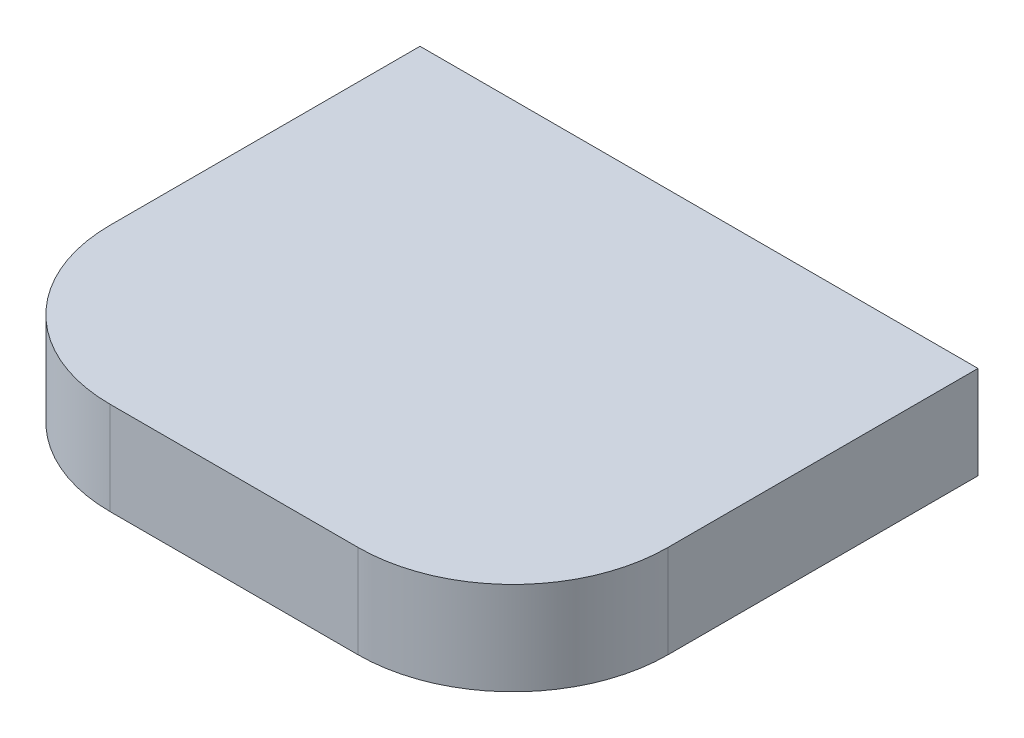
ISO-10303-21;
HEADER;
FILE_DESCRIPTION(('STEP AP214'),'2;1');
FILE_NAME('part.step','',(''),(''),'','','');
FILE_SCHEMA(('AUTOMOTIVE_DESIGN { 1 0 10303 214 1 1 1 1 }'));
ENDSEC;
DATA;
#1=APPLICATION_CONTEXT('core data for automotive mechanical design processes');
#2=APPLICATION_PROTOCOL_DEFINITION('international standard','automotive_design',2000,#1);
#3=PRODUCT_CONTEXT('',#1,'mechanical');
#4=PRODUCT('Part','Part','',(#3));
#5=PRODUCT_RELATED_PRODUCT_CATEGORY('part','',(#4));
#6=PRODUCT_DEFINITION_FORMATION('','',#4);
#7=PRODUCT_DEFINITION_CONTEXT('part definition',#1,'design');
#8=PRODUCT_DEFINITION('design','',#6,#7);
#9=PRODUCT_DEFINITION_SHAPE('','',#8);
#10=(LENGTH_UNIT() NAMED_UNIT(*) SI_UNIT(.MILLI.,.METRE.));
#11=(NAMED_UNIT(*) PLANE_ANGLE_UNIT() SI_UNIT($,.RADIAN.));
#12=(NAMED_UNIT(*) SI_UNIT($,.STERADIAN.) SOLID_ANGLE_UNIT());
#13=UNCERTAINTY_MEASURE_WITH_UNIT(LENGTH_MEASURE(1.E-05),#10,'distance_accuracy_value','');
#14=(GEOMETRIC_REPRESENTATION_CONTEXT(3) GLOBAL_UNCERTAINTY_ASSIGNED_CONTEXT((#13)) GLOBAL_UNIT_ASSIGNED_CONTEXT((#10,
#11,#12)) REPRESENTATION_CONTEXT('',''));
#15=CARTESIAN_POINT('',(0.,0.,0.));
#16=DIRECTION('',(0.,0.,1.));
#17=DIRECTION('',(1.,0.,0.));
#18=AXIS2_PLACEMENT_3D('',#15,#16,#17);
#19=CARTESIAN_POINT('',(-22.86,7.62,-19.19));
#20=DIRECTION('',(1.,0.,0.));
#21=DIRECTION('',(0.,0.,-1.));
#22=AXIS2_PLACEMENT_3D('',#19,#20,#21);
#23=PLANE('',#22);
#24=DIRECTION('',(0.,0.,1.));
#25=VECTOR('',#24,1.);
#26=CARTESIAN_POINT('',(-22.86,0.,-19.19));
#27=LINE('',#26,#25);
#28=CARTESIAN_POINT('',(-22.86,0.,-19.19));
#29=VERTEX_POINT('',#28);
#30=CARTESIAN_POINT('',(-22.86,0.,6.21));
#31=VERTEX_POINT('',#30);
#32=EDGE_CURVE('E121',#29,#31,#27,.T.);
#33=ORIENTED_EDGE('',*,*,#32,.T.);
#34=DIRECTION('',(0.,-1.,0.));
#35=VECTOR('',#34,1.);
#36=CARTESIAN_POINT('',(-22.86,7.62,6.21));
#37=LINE('',#36,#35);
#38=CARTESIAN_POINT('',(-22.86,7.62,6.21));
#39=VERTEX_POINT('',#38);
#40=EDGE_CURVE('E11',#39,#31,#37,.T.);
#41=ORIENTED_EDGE('',*,*,#40,.F.);
#42=DIRECTION('',(0.,0.,1.));
#43=VECTOR('',#42,1.);
#44=CARTESIAN_POINT('',(-22.86,7.62,-19.19));
#45=LINE('',#44,#43);
#46=CARTESIAN_POINT('',(-22.86,7.62,-19.19));
#47=VERTEX_POINT('',#46);
#48=EDGE_CURVE('E131',#47,#39,#45,.T.);
#49=ORIENTED_EDGE('',*,*,#48,.F.);
#50=DIRECTION('',(0.,-1.,0.));
#51=VECTOR('',#50,1.);
#52=CARTESIAN_POINT('',(-22.86,7.62,-19.19));
#53=LINE('',#52,#51);
#54=EDGE_CURVE('E117',#47,#29,#53,.T.);
#55=ORIENTED_EDGE('',*,*,#54,.T.);
#56=EDGE_LOOP('',(#33,#41,#49,#55));
#57=FACE_BOUND('',#56,.T.);
#58=ADVANCED_FACE('F37',(#57),#23,.F.);
#59=CARTESIAN_POINT('',(-10.16,7.62,6.21));
#60=DIRECTION('',(0.,-1.,0.));
#61=DIRECTION('',(0.,0.,-1.));
#62=AXIS2_PLACEMENT_3D('',#59,#60,#61);
#63=CYLINDRICAL_SURFACE('',#62,12.7);
#64=CARTESIAN_POINT('',(-10.16,0.,6.21));
#65=DIRECTION('',(0.,1.,0.));
#66=DIRECTION('',(0.,0.,1.));
#67=AXIS2_PLACEMENT_3D('',#64,#65,#66);
#68=CIRCLE('',#67,12.7);
#69=CARTESIAN_POINT('',(-10.16,0.,18.91));
#70=VERTEX_POINT('',#69);
#71=EDGE_CURVE('E124',#31,#70,#68,.T.);
#72=ORIENTED_EDGE('',*,*,#71,.T.);
#73=DIRECTION('',(0.,-1.,0.));
#74=VECTOR('',#73,1.);
#75=CARTESIAN_POINT('',(-10.16,7.62,18.91));
#76=LINE('',#75,#74);
#77=CARTESIAN_POINT('',(-10.16,7.62,18.91));
#78=VERTEX_POINT('',#77);
#79=EDGE_CURVE('E45',#78,#70,#76,.T.);
#80=ORIENTED_EDGE('',*,*,#79,.F.);
#81=CARTESIAN_POINT('',(-10.16,7.62,6.21));
#82=DIRECTION('',(0.,1.,0.));
#83=DIRECTION('',(0.,0.,1.));
#84=AXIS2_PLACEMENT_3D('',#81,#82,#83);
#85=CIRCLE('',#84,12.7);
#86=EDGE_CURVE('E90',#39,#78,#85,.T.);
#87=ORIENTED_EDGE('',*,*,#86,.F.);
#88=ORIENTED_EDGE('',*,*,#40,.T.);
#89=EDGE_LOOP('',(#72,#80,#87,#88));
#90=FACE_BOUND('',#89,.T.);
#91=ADVANCED_FACE('F155',(#90),#63,.T.);
#92=CARTESIAN_POINT('',(-10.16,7.62,18.91));
#93=DIRECTION('',(0.,0.,-1.));
#94=DIRECTION('',(-1.,0.,0.));
#95=AXIS2_PLACEMENT_3D('',#92,#93,#94);
#96=PLANE('',#95);
#97=DIRECTION('',(1.,0.,0.));
#98=VECTOR('',#97,1.);
#99=CARTESIAN_POINT('',(-10.16,0.,18.91));
#100=LINE('',#99,#98);
#101=CARTESIAN_POINT('',(10.16,0.,18.91));
#102=VERTEX_POINT('',#101);
#103=EDGE_CURVE('E126',#70,#102,#100,.T.);
#104=ORIENTED_EDGE('',*,*,#103,.T.);
#105=DIRECTION('',(0.,-1.,0.));
#106=VECTOR('',#105,1.);
#107=CARTESIAN_POINT('',(10.16,7.62,18.91));
#108=LINE('',#107,#106);
#109=CARTESIAN_POINT('',(10.16,7.62,18.91));
#110=VERTEX_POINT('',#109);
#111=EDGE_CURVE('E112',#110,#102,#108,.T.);
#112=ORIENTED_EDGE('',*,*,#111,.F.);
#113=DIRECTION('',(1.,0.,0.));
#114=VECTOR('',#113,1.);
#115=CARTESIAN_POINT('',(-10.16,7.62,18.91));
#116=LINE('',#115,#114);
#117=EDGE_CURVE('E103',#78,#110,#116,.T.);
#118=ORIENTED_EDGE('',*,*,#117,.F.);
#119=ORIENTED_EDGE('',*,*,#79,.T.);
#120=EDGE_LOOP('',(#104,#112,#118,#119));
#121=FACE_BOUND('',#120,.T.);
#122=ADVANCED_FACE('F137',(#121),#96,.F.);
#123=CARTESIAN_POINT('',(10.16,7.62,6.21000000000001));
#124=DIRECTION('',(0.,-1.,0.));
#125=DIRECTION('',(0.,0.,-1.));
#126=AXIS2_PLACEMENT_3D('',#123,#124,#125);
#127=CYLINDRICAL_SURFACE('',#126,12.7);
#128=CARTESIAN_POINT('',(10.16,0.,6.21000000000001));
#129=DIRECTION('',(0.,1.,0.));
#130=DIRECTION('',(0.,0.,-1.));
#131=AXIS2_PLACEMENT_3D('',#128,#129,#130);
#132=CIRCLE('',#131,12.7);
#133=CARTESIAN_POINT('',(22.86,0.,6.21));
#134=VERTEX_POINT('',#133);
#135=EDGE_CURVE('E111',#102,#134,#132,.T.);
#136=ORIENTED_EDGE('',*,*,#135,.T.);
#137=DIRECTION('',(0.,-1.,0.));
#138=VECTOR('',#137,1.);
#139=CARTESIAN_POINT('',(22.86,7.62,6.21));
#140=LINE('',#139,#138);
#141=CARTESIAN_POINT('',(22.86,7.62,6.21));
#142=VERTEX_POINT('',#141);
#143=EDGE_CURVE('E108',#142,#134,#140,.T.);
#144=ORIENTED_EDGE('',*,*,#143,.F.);
#145=CARTESIAN_POINT('',(10.16,7.62,6.21000000000001));
#146=DIRECTION('',(0.,1.,0.));
#147=DIRECTION('',(0.,0.,-1.));
#148=AXIS2_PLACEMENT_3D('',#145,#146,#147);
#149=CIRCLE('',#148,12.7);
#150=EDGE_CURVE('E97',#110,#142,#149,.T.);
#151=ORIENTED_EDGE('',*,*,#150,.F.);
#152=ORIENTED_EDGE('',*,*,#111,.T.);
#153=EDGE_LOOP('',(#136,#144,#151,#152));
#154=FACE_BOUND('',#153,.T.);
#155=ADVANCED_FACE('F109',(#154),#127,.T.);
#156=CARTESIAN_POINT('',(22.86,7.62,-19.19));
#157=DIRECTION('',(-1.,0.,0.));
#158=DIRECTION('',(0.,0.,1.));
#159=AXIS2_PLACEMENT_3D('',#156,#157,#158);
#160=PLANE('',#159);
#161=DIRECTION('',(0.,0.,-1.));
#162=VECTOR('',#161,1.);
#163=CARTESIAN_POINT('',(22.86,0.,-19.19));
#164=LINE('',#163,#162);
#165=CARTESIAN_POINT('',(22.86,0.,-19.19));
#166=VERTEX_POINT('',#165);
#167=EDGE_CURVE('E76',#134,#166,#164,.T.);
#168=ORIENTED_EDGE('',*,*,#167,.T.);
#169=DIRECTION('',(0.,-1.,0.));
#170=VECTOR('',#169,1.);
#171=CARTESIAN_POINT('',(22.86,7.62,-19.19));
#172=LINE('',#171,#170);
#173=CARTESIAN_POINT('',(22.86,7.62,-19.19));
#174=VERTEX_POINT('',#173);
#175=EDGE_CURVE('E113',#174,#166,#172,.T.);
#176=ORIENTED_EDGE('',*,*,#175,.F.);
#177=DIRECTION('',(0.,0.,-1.));
#178=VECTOR('',#177,1.);
#179=CARTESIAN_POINT('',(22.86,7.62,-19.19));
#180=LINE('',#179,#178);
#181=EDGE_CURVE('E101',#142,#174,#180,.T.);
#182=ORIENTED_EDGE('',*,*,#181,.F.);
#183=ORIENTED_EDGE('',*,*,#143,.T.);
#184=EDGE_LOOP('',(#168,#176,#182,#183));
#185=FACE_BOUND('',#184,.T.);
#186=ADVANCED_FACE('F115',(#185),#160,.F.);
#187=CARTESIAN_POINT('',(22.86,7.62,-19.19));
#188=DIRECTION('',(0.,0.,1.));
#189=DIRECTION('',(1.,0.,0.));
#190=AXIS2_PLACEMENT_3D('',#187,#188,#189);
#191=PLANE('',#190);
#192=DIRECTION('',(-1.,0.,0.));
#193=VECTOR('',#192,1.);
#194=CARTESIAN_POINT('',(22.86,0.,-19.19));
#195=LINE('',#194,#193);
#196=EDGE_CURVE('E82',#166,#29,#195,.T.);
#197=ORIENTED_EDGE('',*,*,#196,.T.);
#198=ORIENTED_EDGE('',*,*,#54,.F.);
#199=DIRECTION('',(-1.,0.,0.));
#200=VECTOR('',#199,1.);
#201=CARTESIAN_POINT('',(22.86,7.62,-19.19));
#202=LINE('',#201,#200);
#203=EDGE_CURVE('E53',#174,#47,#202,.T.);
#204=ORIENTED_EDGE('',*,*,#203,.F.);
#205=ORIENTED_EDGE('',*,*,#175,.T.);
#206=EDGE_LOOP('',(#197,#198,#204,#205));
#207=FACE_BOUND('',#206,.T.);
#208=ADVANCED_FACE('F144',(#207),#191,.F.);
#209=CARTESIAN_POINT('',(-10.16,7.62,6.21));
#210=DIRECTION('',(0.,1.,0.));
#211=DIRECTION('',(0.,0.,1.));
#212=AXIS2_PLACEMENT_3D('',#209,#210,#211);
#213=PLANE('',#212);
#214=ORIENTED_EDGE('',*,*,#48,.T.);
#215=ORIENTED_EDGE('',*,*,#86,.T.);
#216=ORIENTED_EDGE('',*,*,#117,.T.);
#217=ORIENTED_EDGE('',*,*,#150,.T.);
#218=ORIENTED_EDGE('',*,*,#181,.T.);
#219=ORIENTED_EDGE('',*,*,#203,.T.);
#220=EDGE_LOOP('',(#214,#215,#216,#217,#218,#219));
#221=FACE_BOUND('',#220,.T.);
#222=ADVANCED_FACE('F99',(#221),#213,.T.);
#223=CARTESIAN_POINT('',(-10.16,0.,6.21));
#224=DIRECTION('',(0.,1.,0.));
#225=DIRECTION('',(0.,0.,1.));
#226=AXIS2_PLACEMENT_3D('',#223,#224,#225);
#227=PLANE('',#226);
#228=ORIENTED_EDGE('',*,*,#32,.F.);
#229=ORIENTED_EDGE('',*,*,#196,.F.);
#230=ORIENTED_EDGE('',*,*,#167,.F.);
#231=ORIENTED_EDGE('',*,*,#135,.F.);
#232=ORIENTED_EDGE('',*,*,#103,.F.);
#233=ORIENTED_EDGE('',*,*,#71,.F.);
#234=EDGE_LOOP('',(#228,#229,#230,#231,#232,#233));
#235=FACE_BOUND('',#234,.T.);
#236=ADVANCED_FACE('F140',(#235),#227,.F.);
#237=CLOSED_SHELL('',(#58,#91,#122,#155,#186,#208,#222,#236));
#238=MANIFOLD_SOLID_BREP('B2',#237);
#239=ADVANCED_BREP_SHAPE_REPRESENTATION('',(#18,#238),#14);
#240=SHAPE_DEFINITION_REPRESENTATION(#9,#239);
ENDSEC;
END-ISO-10303-21;
